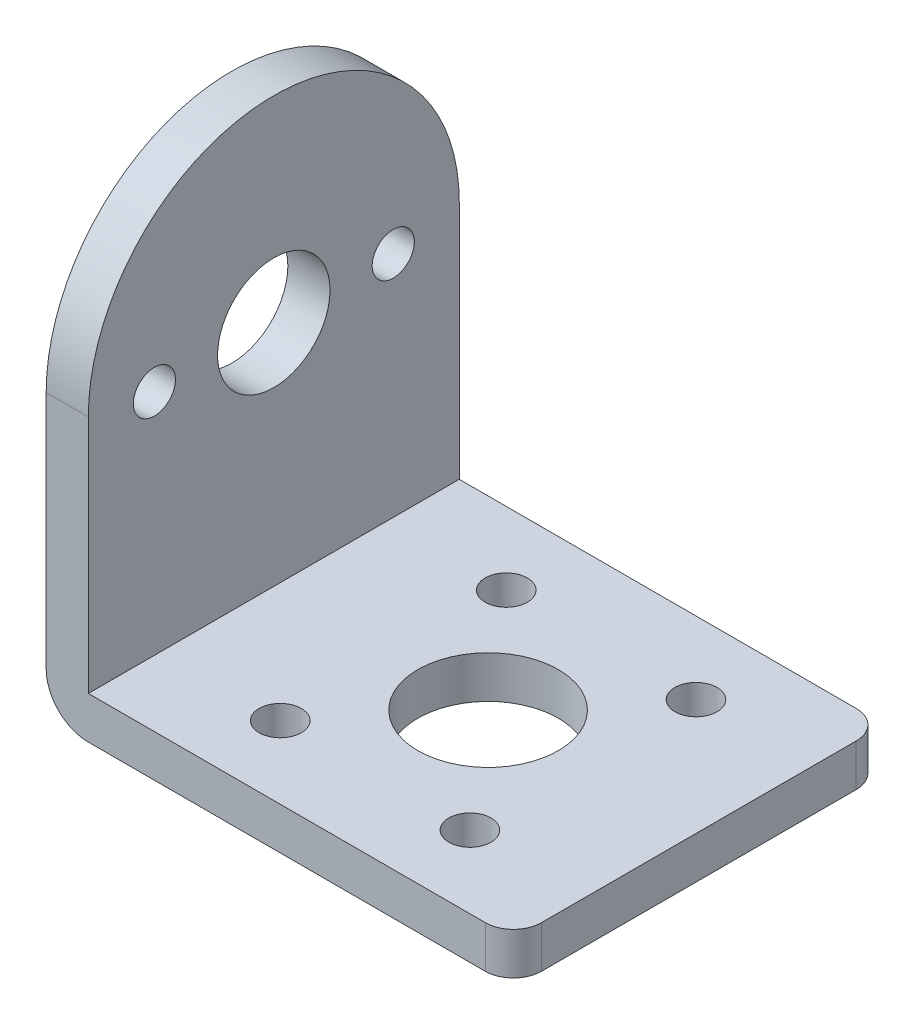
ISO-10303-21;
HEADER;
FILE_DESCRIPTION(('STEP AP214'),'2;1');
FILE_NAME('part.step','',(''),(''),'','','');
FILE_SCHEMA(('AUTOMOTIVE_DESIGN { 1 0 10303 214 1 1 1 1 }'));
ENDSEC;
DATA;
#1=APPLICATION_CONTEXT('core data for automotive mechanical design processes');
#2=APPLICATION_PROTOCOL_DEFINITION('international standard','automotive_design',2000,#1);
#3=PRODUCT_CONTEXT('',#1,'mechanical');
#4=PRODUCT('Part','Part','',(#3));
#5=PRODUCT_RELATED_PRODUCT_CATEGORY('part','',(#4));
#6=PRODUCT_DEFINITION_FORMATION('','',#4);
#7=PRODUCT_DEFINITION_CONTEXT('part definition',#1,'design');
#8=PRODUCT_DEFINITION('design','',#6,#7);
#9=PRODUCT_DEFINITION_SHAPE('','',#8);
#10=(LENGTH_UNIT() NAMED_UNIT(*) SI_UNIT(.MILLI.,.METRE.));
#11=(NAMED_UNIT(*) PLANE_ANGLE_UNIT() SI_UNIT($,.RADIAN.));
#12=(NAMED_UNIT(*) SI_UNIT($,.STERADIAN.) SOLID_ANGLE_UNIT());
#13=UNCERTAINTY_MEASURE_WITH_UNIT(LENGTH_MEASURE(1.E-05),#10,'distance_accuracy_value','');
#14=(GEOMETRIC_REPRESENTATION_CONTEXT(3) GLOBAL_UNCERTAINTY_ASSIGNED_CONTEXT((#13)) GLOBAL_UNIT_ASSIGNED_CONTEXT((#10,
#11,#12)) REPRESENTATION_CONTEXT('',''));
#15=CARTESIAN_POINT('',(0.,0.,0.));
#16=DIRECTION('',(0.,0.,1.));
#17=DIRECTION('',(1.,0.,0.));
#18=AXIS2_PLACEMENT_3D('',#15,#16,#17);
#19=CARTESIAN_POINT('',(-13.625,33.25,0.));
#20=DIRECTION('',(1.,0.,0.));
#21=DIRECTION('',(0.,0.,-1.));
#22=AXIS2_PLACEMENT_3D('',#19,#20,#21);
#23=PLANE('',#22);
#24=CARTESIAN_POINT('',(-13.625,19.25,8.5));
#25=DIRECTION('',(1.,0.,0.));
#26=DIRECTION('',(0.,0.,1.));
#27=AXIS2_PLACEMENT_3D('',#24,#25,#26);
#28=CIRCLE('',#27,1.5);
#29=CARTESIAN_POINT('',(-13.625,19.25,7.));
#30=VERTEX_POINT('',#29);
#31=EDGE_CURVE('E342',#30,#30,#28,.T.);
#32=ORIENTED_EDGE('',*,*,#31,.F.);
#33=EDGE_LOOP('',(#32));
#34=FACE_BOUND('',#33,.T.);
#35=CARTESIAN_POINT('',(-13.625,19.25,-8.5));
#36=DIRECTION('',(1.,0.,0.));
#37=DIRECTION('',(0.,0.,-1.));
#38=AXIS2_PLACEMENT_3D('',#35,#36,#37);
#39=CIRCLE('',#38,1.5);
#40=CARTESIAN_POINT('',(-13.625,19.25,-10.));
#41=VERTEX_POINT('',#40);
#42=EDGE_CURVE('E337',#41,#41,#39,.T.);
#43=ORIENTED_EDGE('',*,*,#42,.F.);
#44=EDGE_LOOP('',(#43));
#45=FACE_BOUND('',#44,.T.);
#46=CARTESIAN_POINT('',(-13.625,19.25,0.));
#47=DIRECTION('',(1.,0.,0.));
#48=DIRECTION('',(0.,0.,-1.));
#49=AXIS2_PLACEMENT_3D('',#46,#47,#48);
#50=CIRCLE('',#49,4.);
#51=CARTESIAN_POINT('',(-13.625,19.25,-4.));
#52=VERTEX_POINT('',#51);
#53=EDGE_CURVE('E331',#52,#52,#50,.T.);
#54=ORIENTED_EDGE('',*,*,#53,.F.);
#55=EDGE_LOOP('',(#54));
#56=FACE_BOUND('',#55,.T.);
#57=DIRECTION('',(0.,-1.,0.));
#58=VECTOR('',#57,1.);
#59=CARTESIAN_POINT('',(-13.625,33.25,-13.2));
#60=LINE('',#59,#58);
#61=CARTESIAN_POINT('',(-13.625,20.05,-13.2));
#62=VERTEX_POINT('',#61);
#63=CARTESIAN_POINT('',(-13.625,3.,-13.2));
#64=VERTEX_POINT('',#63);
#65=EDGE_CURVE('E141',#62,#64,#60,.T.);
#66=ORIENTED_EDGE('',*,*,#65,.F.);
#67=CARTESIAN_POINT('',(-13.625,20.05,0.));
#68=DIRECTION('',(1.,0.,0.));
#69=DIRECTION('',(0.,0.,-1.));
#70=AXIS2_PLACEMENT_3D('',#67,#68,#69);
#71=CIRCLE('',#70,13.2);
#72=CARTESIAN_POINT('',(-13.625,20.05,13.2));
#73=VERTEX_POINT('',#72);
#74=EDGE_CURVE('E130',#62,#73,#71,.T.);
#75=ORIENTED_EDGE('',*,*,#74,.T.);
#76=DIRECTION('',(0.,-1.,0.));
#77=VECTOR('',#76,1.);
#78=CARTESIAN_POINT('',(-13.625,33.25,13.2));
#79=LINE('',#78,#77);
#80=CARTESIAN_POINT('',(-13.625,3.,13.2));
#81=VERTEX_POINT('',#80);
#82=EDGE_CURVE('E143',#73,#81,#79,.T.);
#83=ORIENTED_EDGE('',*,*,#82,.T.);
#84=DIRECTION('',(0.,0.,1.));
#85=VECTOR('',#84,1.);
#86=CARTESIAN_POINT('',(-13.625,3.,0.));
#87=LINE('',#86,#85);
#88=EDGE_CURVE('E156',#64,#81,#87,.T.);
#89=ORIENTED_EDGE('',*,*,#88,.F.);
#90=EDGE_LOOP('',(#66,#75,#83,#89));
#91=FACE_BOUND('',#90,.T.);
#92=ADVANCED_FACE('F43',(#34,#45,#56,#91),#23,.T.);
#93=CARTESIAN_POINT('',(-16.625,33.25,0.));
#94=DIRECTION('',(1.,0.,0.));
#95=DIRECTION('',(0.,0.,-1.));
#96=AXIS2_PLACEMENT_3D('',#93,#94,#95);
#97=PLANE('',#96);
#98=CARTESIAN_POINT('',(-16.625,19.25,8.5));
#99=DIRECTION('',(1.,0.,0.));
#100=DIRECTION('',(0.,0.,1.));
#101=AXIS2_PLACEMENT_3D('',#98,#99,#100);
#102=CIRCLE('',#101,1.5);
#103=CARTESIAN_POINT('',(-16.625,19.25,7.));
#104=VERTEX_POINT('',#103);
#105=EDGE_CURVE('E345',#104,#104,#102,.T.);
#106=ORIENTED_EDGE('',*,*,#105,.T.);
#107=EDGE_LOOP('',(#106));
#108=FACE_BOUND('',#107,.T.);
#109=CARTESIAN_POINT('',(-16.625,19.25,-8.5));
#110=DIRECTION('',(1.,0.,0.));
#111=DIRECTION('',(0.,0.,-1.));
#112=AXIS2_PLACEMENT_3D('',#109,#110,#111);
#113=CIRCLE('',#112,1.5);
#114=CARTESIAN_POINT('',(-16.625,19.25,-10.));
#115=VERTEX_POINT('',#114);
#116=EDGE_CURVE('E333',#115,#115,#113,.T.);
#117=ORIENTED_EDGE('',*,*,#116,.T.);
#118=EDGE_LOOP('',(#117));
#119=FACE_BOUND('',#118,.T.);
#120=CARTESIAN_POINT('',(-16.625,19.25,0.));
#121=DIRECTION('',(1.,0.,0.));
#122=DIRECTION('',(0.,0.,-1.));
#123=AXIS2_PLACEMENT_3D('',#120,#121,#122);
#124=CIRCLE('',#123,4.);
#125=CARTESIAN_POINT('',(-16.625,19.25,-4.));
#126=VERTEX_POINT('',#125);
#127=EDGE_CURVE('E133',#126,#126,#124,.T.);
#128=ORIENTED_EDGE('',*,*,#127,.T.);
#129=EDGE_LOOP('',(#128));
#130=FACE_BOUND('',#129,.T.);
#131=CARTESIAN_POINT('',(-16.625,20.05,0.));
#132=DIRECTION('',(1.,0.,0.));
#133=DIRECTION('',(0.,0.,-1.));
#134=AXIS2_PLACEMENT_3D('',#131,#132,#133);
#135=CIRCLE('',#134,13.2);
#136=CARTESIAN_POINT('',(-16.625,20.05,-13.2));
#137=VERTEX_POINT('',#136);
#138=CARTESIAN_POINT('',(-16.625,20.05,13.2));
#139=VERTEX_POINT('',#138);
#140=EDGE_CURVE('E114',#137,#139,#135,.T.);
#141=ORIENTED_EDGE('',*,*,#140,.F.);
#142=DIRECTION('',(0.,-1.,0.));
#143=VECTOR('',#142,1.);
#144=CARTESIAN_POINT('',(-16.625,33.25,-13.2));
#145=LINE('',#144,#143);
#146=CARTESIAN_POINT('',(-16.625,3.,-13.2));
#147=VERTEX_POINT('',#146);
#148=EDGE_CURVE('E119',#137,#147,#145,.T.);
#149=ORIENTED_EDGE('',*,*,#148,.T.);
#150=DIRECTION('',(0.,0.,1.));
#151=VECTOR('',#150,1.);
#152=CARTESIAN_POINT('',(-16.625,3.,0.));
#153=LINE('',#152,#151);
#154=CARTESIAN_POINT('',(-16.625,3.,13.2));
#155=VERTEX_POINT('',#154);
#156=EDGE_CURVE('E161',#147,#155,#153,.T.);
#157=ORIENTED_EDGE('',*,*,#156,.T.);
#158=DIRECTION('',(0.,-1.,0.));
#159=VECTOR('',#158,1.);
#160=CARTESIAN_POINT('',(-16.625,33.25,13.2));
#161=LINE('',#160,#159);
#162=EDGE_CURVE('E121',#139,#155,#161,.T.);
#163=ORIENTED_EDGE('',*,*,#162,.F.);
#164=EDGE_LOOP('',(#141,#149,#157,#163));
#165=FACE_BOUND('',#164,.T.);
#166=ADVANCED_FACE('F116',(#108,#119,#130,#165),#97,.F.);
#167=CARTESIAN_POINT('',(0.,3.,-13.2));
#168=DIRECTION('',(0.,0.,-1.));
#169=DIRECTION('',(-1.,0.,0.));
#170=AXIS2_PLACEMENT_3D('',#167,#168,#169);
#171=PLANE('',#170);
#172=DIRECTION('',(1.,0.,0.));
#173=VECTOR('',#172,1.);
#174=CARTESIAN_POINT('',(0.,3.,-13.2));
#175=LINE('',#174,#173);
#176=CARTESIAN_POINT('',(14.625,3.,-13.2));
#177=VERTEX_POINT('',#176);
#178=EDGE_CURVE('E153',#64,#177,#175,.T.);
#179=ORIENTED_EDGE('',*,*,#178,.T.);
#180=DIRECTION('',(0.,-1.,0.));
#181=VECTOR('',#180,1.);
#182=CARTESIAN_POINT('',(14.625,3.,-13.2));
#183=LINE('',#182,#181);
#184=CARTESIAN_POINT('',(14.625,0.,-13.2));
#185=VERTEX_POINT('',#184);
#186=EDGE_CURVE('E174',#177,#185,#183,.T.);
#187=ORIENTED_EDGE('',*,*,#186,.T.);
#188=DIRECTION('',(1.,0.,0.));
#189=VECTOR('',#188,1.);
#190=CARTESIAN_POINT('',(0.,0.,-13.2));
#191=LINE('',#190,#189);
#192=CARTESIAN_POINT('',(-13.625,0.,-13.2));
#193=VERTEX_POINT('',#192);
#194=EDGE_CURVE('E164',#193,#185,#191,.T.);
#195=ORIENTED_EDGE('',*,*,#194,.F.);
#196=CARTESIAN_POINT('',(-13.625,3.,-13.2));
#197=DIRECTION('',(0.,0.,-1.));
#198=DIRECTION('',(-1.,0.,0.));
#199=AXIS2_PLACEMENT_3D('',#196,#197,#198);
#200=CIRCLE('',#199,3.);
#201=EDGE_CURVE('E139',#193,#147,#200,.T.);
#202=ORIENTED_EDGE('',*,*,#201,.T.);
#203=ORIENTED_EDGE('',*,*,#148,.F.);
#204=DIRECTION('',(1.,0.,0.));
#205=VECTOR('',#204,1.);
#206=CARTESIAN_POINT('',(-16.625,20.05,-13.2));
#207=LINE('',#206,#205);
#208=EDGE_CURVE('E125',#137,#62,#207,.T.);
#209=ORIENTED_EDGE('',*,*,#208,.T.);
#210=ORIENTED_EDGE('',*,*,#65,.T.);
#211=EDGE_LOOP('',(#179,#187,#195,#202,#203,#209,#210));
#212=FACE_BOUND('',#211,.T.);
#213=ADVANCED_FACE('F136',(#212),#171,.T.);
#214=CARTESIAN_POINT('',(0.,3.,13.2));
#215=DIRECTION('',(0.,0.,-1.));
#216=DIRECTION('',(-1.,0.,0.));
#217=AXIS2_PLACEMENT_3D('',#214,#215,#216);
#218=PLANE('',#217);
#219=DIRECTION('',(1.,0.,0.));
#220=VECTOR('',#219,1.);
#221=CARTESIAN_POINT('',(0.,0.,13.2));
#222=LINE('',#221,#220);
#223=CARTESIAN_POINT('',(-13.625,0.,13.2));
#224=VERTEX_POINT('',#223);
#225=CARTESIAN_POINT('',(14.625,0.,13.2));
#226=VERTEX_POINT('',#225);
#227=EDGE_CURVE('E154',#224,#226,#222,.T.);
#228=ORIENTED_EDGE('',*,*,#227,.T.);
#229=DIRECTION('',(0.,-1.,0.));
#230=VECTOR('',#229,1.);
#231=CARTESIAN_POINT('',(14.625,3.,13.2));
#232=LINE('',#231,#230);
#233=CARTESIAN_POINT('',(14.625,3.,13.2));
#234=VERTEX_POINT('',#233);
#235=EDGE_CURVE('E12',#226,#234,#232,.F.);
#236=ORIENTED_EDGE('',*,*,#235,.T.);
#237=DIRECTION('',(1.,0.,0.));
#238=VECTOR('',#237,1.);
#239=CARTESIAN_POINT('',(0.,3.,13.2));
#240=LINE('',#239,#238);
#241=EDGE_CURVE('E159',#81,#234,#240,.T.);
#242=ORIENTED_EDGE('',*,*,#241,.F.);
#243=ORIENTED_EDGE('',*,*,#82,.F.);
#244=DIRECTION('',(1.,0.,0.));
#245=VECTOR('',#244,1.);
#246=CARTESIAN_POINT('',(-16.625,20.05,13.2));
#247=LINE('',#246,#245);
#248=EDGE_CURVE('E124',#139,#73,#247,.T.);
#249=ORIENTED_EDGE('',*,*,#248,.F.);
#250=ORIENTED_EDGE('',*,*,#162,.T.);
#251=CARTESIAN_POINT('',(-13.625,3.,13.2));
#252=DIRECTION('',(0.,0.,-1.));
#253=DIRECTION('',(-1.,0.,0.));
#254=AXIS2_PLACEMENT_3D('',#251,#252,#253);
#255=CIRCLE('',#254,3.);
#256=EDGE_CURVE('E169',#155,#224,#255,.F.);
#257=ORIENTED_EDGE('',*,*,#256,.T.);
#258=EDGE_LOOP('',(#228,#236,#242,#243,#249,#250,#257));
#259=FACE_BOUND('',#258,.T.);
#260=ADVANCED_FACE('F203',(#259),#218,.F.);
#261=CARTESIAN_POINT('',(16.625,3.,0.));
#262=DIRECTION('',(1.,0.,0.));
#263=DIRECTION('',(0.,0.,-1.));
#264=AXIS2_PLACEMENT_3D('',#261,#262,#263);
#265=PLANE('',#264);
#266=DIRECTION('',(0.,0.,1.));
#267=VECTOR('',#266,1.);
#268=CARTESIAN_POINT('',(16.625,0.,0.));
#269=LINE('',#268,#267);
#270=CARTESIAN_POINT('',(16.625,0.,-11.2));
#271=VERTEX_POINT('',#270);
#272=CARTESIAN_POINT('',(16.625,0.,11.2));
#273=VERTEX_POINT('',#272);
#274=EDGE_CURVE('E150',#271,#273,#269,.T.);
#275=ORIENTED_EDGE('',*,*,#274,.F.);
#276=DIRECTION('',(0.,-1.,0.));
#277=VECTOR('',#276,1.);
#278=CARTESIAN_POINT('',(16.625,3.,-11.2));
#279=LINE('',#278,#277);
#280=CARTESIAN_POINT('',(16.625,3.,-11.2));
#281=VERTEX_POINT('',#280);
#282=EDGE_CURVE('E184',#271,#281,#279,.F.);
#283=ORIENTED_EDGE('',*,*,#282,.T.);
#284=DIRECTION('',(0.,0.,1.));
#285=VECTOR('',#284,1.);
#286=CARTESIAN_POINT('',(16.625,3.,0.));
#287=LINE('',#286,#285);
#288=CARTESIAN_POINT('',(16.625,3.,11.2));
#289=VERTEX_POINT('',#288);
#290=EDGE_CURVE('E151',#281,#289,#287,.T.);
#291=ORIENTED_EDGE('',*,*,#290,.T.);
#292=DIRECTION('',(0.,-1.,0.));
#293=VECTOR('',#292,1.);
#294=CARTESIAN_POINT('',(16.625,0.,11.2));
#295=LINE('',#294,#293);
#296=EDGE_CURVE('E181',#289,#273,#295,.T.);
#297=ORIENTED_EDGE('',*,*,#296,.T.);
#298=EDGE_LOOP('',(#275,#283,#291,#297));
#299=FACE_BOUND('',#298,.T.);
#300=ADVANCED_FACE('F198',(#299),#265,.T.);
#301=CARTESIAN_POINT('',(0.,3.,0.));
#302=DIRECTION('',(0.,1.,0.));
#303=DIRECTION('',(0.,0.,1.));
#304=AXIS2_PLACEMENT_3D('',#301,#302,#303);
#305=PLANE('',#304);
#306=CARTESIAN_POINT('',(-5.125,3.,-8.04285397107271));
#307=DIRECTION('',(0.,1.,0.));
#308=DIRECTION('',(0.,0.,1.));
#309=AXIS2_PLACEMENT_3D('',#306,#307,#308);
#310=CIRCLE('',#309,1.5);
#311=CARTESIAN_POINT('',(-5.125,3.,-6.5428539710727));
#312=VERTEX_POINT('',#311);
#313=EDGE_CURVE('E357',#312,#312,#310,.T.);
#314=ORIENTED_EDGE('',*,*,#313,.F.);
#315=EDGE_LOOP('',(#314));
#316=FACE_BOUND('',#315,.T.);
#317=CARTESIAN_POINT('',(-5.125,3.,8.04285397107271));
#318=DIRECTION('',(0.,1.,0.));
#319=DIRECTION('',(0.,0.,1.));
#320=AXIS2_PLACEMENT_3D('',#317,#318,#319);
#321=CIRCLE('',#320,1.5);
#322=CARTESIAN_POINT('',(-5.125,3.,9.54285397107271));
#323=VERTEX_POINT('',#322);
#324=EDGE_CURVE('E363',#323,#323,#321,.T.);
#325=ORIENTED_EDGE('',*,*,#324,.F.);
#326=EDGE_LOOP('',(#325));
#327=FACE_BOUND('',#326,.T.);
#328=CARTESIAN_POINT('',(8.375,3.,8.0428539710727));
#329=DIRECTION('',(0.,1.,0.));
#330=DIRECTION('',(0.,0.,1.));
#331=AXIS2_PLACEMENT_3D('',#328,#329,#330);
#332=CIRCLE('',#331,1.5);
#333=CARTESIAN_POINT('',(8.375,3.,9.54285397107271));
#334=VERTEX_POINT('',#333);
#335=EDGE_CURVE('E369',#334,#334,#332,.T.);
#336=ORIENTED_EDGE('',*,*,#335,.F.);
#337=EDGE_LOOP('',(#336));
#338=FACE_BOUND('',#337,.T.);
#339=CARTESIAN_POINT('',(8.375,3.,-8.04285397107271));
#340=DIRECTION('',(0.,1.,0.));
#341=DIRECTION('',(0.,0.,1.));
#342=AXIS2_PLACEMENT_3D('',#339,#340,#341);
#343=CIRCLE('',#342,1.5);
#344=CARTESIAN_POINT('',(8.375,3.,-6.54285397107271));
#345=VERTEX_POINT('',#344);
#346=EDGE_CURVE('E356',#345,#345,#343,.T.);
#347=ORIENTED_EDGE('',*,*,#346,.F.);
#348=EDGE_LOOP('',(#347));
#349=FACE_BOUND('',#348,.T.);
#350=CARTESIAN_POINT('',(1.625,3.,0.));
#351=DIRECTION('',(0.,1.,0.));
#352=DIRECTION('',(0.,0.,1.));
#353=AXIS2_PLACEMENT_3D('',#350,#351,#352);
#354=CIRCLE('',#353,5.);
#355=CARTESIAN_POINT('',(1.625,3.,5.));
#356=VERTEX_POINT('',#355);
#357=EDGE_CURVE('E353',#356,#356,#354,.T.);
#358=ORIENTED_EDGE('',*,*,#357,.F.);
#359=EDGE_LOOP('',(#358));
#360=FACE_BOUND('',#359,.T.);
#361=ORIENTED_EDGE('',*,*,#290,.F.);
#362=CARTESIAN_POINT('',(14.625,3.,-11.2));
#363=DIRECTION('',(0.,1.,0.));
#364=DIRECTION('',(0.,0.,1.));
#365=AXIS2_PLACEMENT_3D('',#362,#363,#364);
#366=CIRCLE('',#365,2.);
#367=EDGE_CURVE('E51',#281,#177,#366,.T.);
#368=ORIENTED_EDGE('',*,*,#367,.T.);
#369=ORIENTED_EDGE('',*,*,#178,.F.);
#370=ORIENTED_EDGE('',*,*,#88,.T.);
#371=ORIENTED_EDGE('',*,*,#241,.T.);
#372=CARTESIAN_POINT('',(14.625,3.,11.2));
#373=DIRECTION('',(0.,1.,0.));
#374=DIRECTION('',(0.,0.,1.));
#375=AXIS2_PLACEMENT_3D('',#372,#373,#374);
#376=CIRCLE('',#375,2.);
#377=EDGE_CURVE('E63',#234,#289,#376,.T.);
#378=ORIENTED_EDGE('',*,*,#377,.T.);
#379=EDGE_LOOP('',(#361,#368,#369,#370,#371,#378));
#380=FACE_BOUND('',#379,.T.);
#381=ADVANCED_FACE('F188',(#316,#327,#338,#349,#360,#380),#305,.T.);
#382=CARTESIAN_POINT('',(0.,0.,0.));
#383=DIRECTION('',(0.,1.,0.));
#384=DIRECTION('',(0.,0.,1.));
#385=AXIS2_PLACEMENT_3D('',#382,#383,#384);
#386=PLANE('',#385);
#387=CARTESIAN_POINT('',(-5.125,0.,-8.04285397107271));
#388=DIRECTION('',(0.,1.,0.));
#389=DIRECTION('',(0.,0.,1.));
#390=AXIS2_PLACEMENT_3D('',#387,#388,#389);
#391=CIRCLE('',#390,1.5);
#392=CARTESIAN_POINT('',(-5.125,0.,-6.5428539710727));
#393=VERTEX_POINT('',#392);
#394=EDGE_CURVE('E360',#393,#393,#391,.F.);
#395=ORIENTED_EDGE('',*,*,#394,.F.);
#396=EDGE_LOOP('',(#395));
#397=FACE_BOUND('',#396,.T.);
#398=CARTESIAN_POINT('',(-5.125,0.,8.04285397107271));
#399=DIRECTION('',(0.,1.,0.));
#400=DIRECTION('',(0.,0.,1.));
#401=AXIS2_PLACEMENT_3D('',#398,#399,#400);
#402=CIRCLE('',#401,1.5);
#403=CARTESIAN_POINT('',(-5.125,0.,9.54285397107271));
#404=VERTEX_POINT('',#403);
#405=EDGE_CURVE('E359',#404,#404,#402,.F.);
#406=ORIENTED_EDGE('',*,*,#405,.F.);
#407=EDGE_LOOP('',(#406));
#408=FACE_BOUND('',#407,.T.);
#409=CARTESIAN_POINT('',(8.375,0.,8.0428539710727));
#410=DIRECTION('',(0.,1.,0.));
#411=DIRECTION('',(0.,0.,1.));
#412=AXIS2_PLACEMENT_3D('',#409,#410,#411);
#413=CIRCLE('',#412,1.5);
#414=CARTESIAN_POINT('',(8.375,0.,9.54285397107271));
#415=VERTEX_POINT('',#414);
#416=EDGE_CURVE('E366',#415,#415,#413,.F.);
#417=ORIENTED_EDGE('',*,*,#416,.F.);
#418=EDGE_LOOP('',(#417));
#419=FACE_BOUND('',#418,.T.);
#420=CARTESIAN_POINT('',(8.375,0.,-8.04285397107271));
#421=DIRECTION('',(0.,1.,0.));
#422=DIRECTION('',(0.,0.,1.));
#423=AXIS2_PLACEMENT_3D('',#420,#421,#422);
#424=CIRCLE('',#423,1.5);
#425=CARTESIAN_POINT('',(8.375,0.,-6.54285397107271));
#426=VERTEX_POINT('',#425);
#427=EDGE_CURVE('E372',#426,#426,#424,.F.);
#428=ORIENTED_EDGE('',*,*,#427,.F.);
#429=EDGE_LOOP('',(#428));
#430=FACE_BOUND('',#429,.T.);
#431=CARTESIAN_POINT('',(1.625,0.,0.));
#432=DIRECTION('',(0.,1.,0.));
#433=DIRECTION('',(0.,0.,1.));
#434=AXIS2_PLACEMENT_3D('',#431,#432,#433);
#435=CIRCLE('',#434,5.);
#436=CARTESIAN_POINT('',(1.625,0.,5.));
#437=VERTEX_POINT('',#436);
#438=EDGE_CURVE('E346',#437,#437,#435,.F.);
#439=ORIENTED_EDGE('',*,*,#438,.F.);
#440=EDGE_LOOP('',(#439));
#441=FACE_BOUND('',#440,.T.);
#442=ORIENTED_EDGE('',*,*,#194,.T.);
#443=CARTESIAN_POINT('',(14.625,0.,-11.2));
#444=DIRECTION('',(0.,1.,0.));
#445=DIRECTION('',(0.,0.,1.));
#446=AXIS2_PLACEMENT_3D('',#443,#444,#445);
#447=CIRCLE('',#446,2.);
#448=EDGE_CURVE('E179',#185,#271,#447,.F.);
#449=ORIENTED_EDGE('',*,*,#448,.T.);
#450=ORIENTED_EDGE('',*,*,#274,.T.);
#451=CARTESIAN_POINT('',(14.625,0.,11.2));
#452=DIRECTION('',(0.,1.,0.));
#453=DIRECTION('',(0.,0.,1.));
#454=AXIS2_PLACEMENT_3D('',#451,#452,#453);
#455=CIRCLE('',#454,2.);
#456=EDGE_CURVE('E177',#273,#226,#455,.F.);
#457=ORIENTED_EDGE('',*,*,#456,.T.);
#458=ORIENTED_EDGE('',*,*,#227,.F.);
#459=DIRECTION('',(0.,0.,1.));
#460=VECTOR('',#459,1.);
#461=CARTESIAN_POINT('',(-13.625,0.,0.));
#462=LINE('',#461,#460);
#463=EDGE_CURVE('E171',#224,#193,#462,.F.);
#464=ORIENTED_EDGE('',*,*,#463,.T.);
#465=EDGE_LOOP('',(#442,#449,#450,#457,#458,#464));
#466=FACE_BOUND('',#465,.T.);
#467=ADVANCED_FACE('F196',(#397,#408,#419,#430,#441,#466),#386,.F.);
#468=CARTESIAN_POINT('',(-13.625,3.,0.));
#469=DIRECTION('',(0.,0.,1.));
#470=DIRECTION('',(1.,0.,0.));
#471=AXIS2_PLACEMENT_3D('',#468,#469,#470);
#472=CYLINDRICAL_SURFACE('',#471,3.);
#473=ORIENTED_EDGE('',*,*,#201,.F.);
#474=ORIENTED_EDGE('',*,*,#463,.F.);
#475=ORIENTED_EDGE('',*,*,#256,.F.);
#476=ORIENTED_EDGE('',*,*,#156,.F.);
#477=EDGE_LOOP('',(#473,#474,#475,#476));
#478=FACE_BOUND('',#477,.T.);
#479=ADVANCED_FACE('F206',(#478),#472,.T.);
#480=CARTESIAN_POINT('',(-16.625,20.05,0.));
#481=DIRECTION('',(1.,0.,0.));
#482=DIRECTION('',(0.,0.,-1.));
#483=AXIS2_PLACEMENT_3D('',#480,#481,#482);
#484=CYLINDRICAL_SURFACE('',#483,13.2);
#485=ORIENTED_EDGE('',*,*,#74,.F.);
#486=ORIENTED_EDGE('',*,*,#208,.F.);
#487=ORIENTED_EDGE('',*,*,#140,.T.);
#488=ORIENTED_EDGE('',*,*,#248,.T.);
#489=EDGE_LOOP('',(#485,#486,#487,#488));
#490=FACE_BOUND('',#489,.T.);
#491=ADVANCED_FACE('F128',(#490),#484,.T.);
#492=CARTESIAN_POINT('',(14.625,3.,-11.2));
#493=DIRECTION('',(0.,-1.,0.));
#494=DIRECTION('',(0.,0.,-1.));
#495=AXIS2_PLACEMENT_3D('',#492,#493,#494);
#496=CYLINDRICAL_SURFACE('',#495,2.);
#497=ORIENTED_EDGE('',*,*,#367,.F.);
#498=ORIENTED_EDGE('',*,*,#282,.F.);
#499=ORIENTED_EDGE('',*,*,#448,.F.);
#500=ORIENTED_EDGE('',*,*,#186,.F.);
#501=EDGE_LOOP('',(#497,#498,#499,#500));
#502=FACE_BOUND('',#501,.T.);
#503=ADVANCED_FACE('F193',(#502),#496,.T.);
#504=CARTESIAN_POINT('',(14.625,3.,11.2));
#505=DIRECTION('',(0.,1.,0.));
#506=DIRECTION('',(0.,0.,1.));
#507=AXIS2_PLACEMENT_3D('',#504,#505,#506);
#508=CYLINDRICAL_SURFACE('',#507,2.);
#509=ORIENTED_EDGE('',*,*,#377,.F.);
#510=ORIENTED_EDGE('',*,*,#235,.F.);
#511=ORIENTED_EDGE('',*,*,#456,.F.);
#512=ORIENTED_EDGE('',*,*,#296,.F.);
#513=EDGE_LOOP('',(#509,#510,#511,#512));
#514=FACE_BOUND('',#513,.T.);
#515=ADVANCED_FACE('F45',(#514),#508,.T.);
#516=CARTESIAN_POINT('',(-16.625,19.25,0.));
#517=DIRECTION('',(1.,0.,0.));
#518=DIRECTION('',(0.,0.,-1.));
#519=AXIS2_PLACEMENT_3D('',#516,#517,#518);
#520=CYLINDRICAL_SURFACE('',#519,4.);
#521=CARTESIAN_POINT('',(-16.625,19.25,-4.));
#522=CARTESIAN_POINT('',(-16.59375,19.25,-4.));
#523=CARTESIAN_POINT('',(-16.5625,19.25,-4.));
#524=CARTESIAN_POINT('',(-16.5,19.25,-4.));
#525=CARTESIAN_POINT('',(-16.46875,19.25,-4.));
#526=CARTESIAN_POINT('',(-16.40625,19.25,-4.));
#527=CARTESIAN_POINT('',(-16.375,19.25,-4.));
#528=CARTESIAN_POINT('',(-16.3125,19.25,-4.));
#529=CARTESIAN_POINT('',(-16.28125,19.25,-4.));
#530=CARTESIAN_POINT('',(-16.21875,19.25,-4.));
#531=CARTESIAN_POINT('',(-16.1875,19.25,-4.));
#532=CARTESIAN_POINT('',(-16.125,19.25,-4.));
#533=CARTESIAN_POINT('',(-16.09375,19.25,-4.));
#534=CARTESIAN_POINT('',(-16.03125,19.25,-4.));
#535=CARTESIAN_POINT('',(-16.,19.25,-4.));
#536=CARTESIAN_POINT('',(-15.9375,19.25,-4.));
#537=CARTESIAN_POINT('',(-15.90625,19.25,-4.));
#538=CARTESIAN_POINT('',(-15.84375,19.25,-4.));
#539=CARTESIAN_POINT('',(-15.8125,19.25,-4.));
#540=CARTESIAN_POINT('',(-15.75,19.25,-4.));
#541=CARTESIAN_POINT('',(-15.71875,19.25,-4.));
#542=CARTESIAN_POINT('',(-15.65625,19.25,-4.));
#543=CARTESIAN_POINT('',(-15.625,19.25,-4.));
#544=CARTESIAN_POINT('',(-15.5625,19.25,-4.));
#545=CARTESIAN_POINT('',(-15.53125,19.25,-4.));
#546=CARTESIAN_POINT('',(-15.46875,19.25,-4.));
#547=CARTESIAN_POINT('',(-15.4375,19.25,-4.));
#548=CARTESIAN_POINT('',(-15.375,19.25,-4.));
#549=CARTESIAN_POINT('',(-15.34375,19.25,-4.));
#550=CARTESIAN_POINT('',(-15.28125,19.25,-4.));
#551=CARTESIAN_POINT('',(-15.25,19.25,-4.));
#552=CARTESIAN_POINT('',(-15.1875,19.25,-4.));
#553=CARTESIAN_POINT('',(-15.15625,19.25,-4.));
#554=CARTESIAN_POINT('',(-15.09375,19.25,-4.));
#555=CARTESIAN_POINT('',(-15.0625,19.25,-4.));
#556=CARTESIAN_POINT('',(-15.,19.25,-4.));
#557=CARTESIAN_POINT('',(-14.96875,19.25,-4.));
#558=CARTESIAN_POINT('',(-14.90625,19.25,-4.));
#559=CARTESIAN_POINT('',(-14.875,19.25,-4.));
#560=CARTESIAN_POINT('',(-14.8125,19.25,-4.));
#561=CARTESIAN_POINT('',(-14.78125,19.25,-4.));
#562=CARTESIAN_POINT('',(-14.71875,19.25,-4.));
#563=CARTESIAN_POINT('',(-14.6875,19.25,-4.));
#564=CARTESIAN_POINT('',(-14.625,19.25,-4.));
#565=CARTESIAN_POINT('',(-14.59375,19.25,-4.));
#566=CARTESIAN_POINT('',(-14.53125,19.25,-4.));
#567=CARTESIAN_POINT('',(-14.5,19.25,-4.));
#568=CARTESIAN_POINT('',(-14.4375,19.25,-4.));
#569=CARTESIAN_POINT('',(-14.40625,19.25,-4.));
#570=CARTESIAN_POINT('',(-14.34375,19.25,-4.));
#571=CARTESIAN_POINT('',(-14.3125,19.25,-4.));
#572=CARTESIAN_POINT('',(-14.25,19.25,-4.));
#573=CARTESIAN_POINT('',(-14.21875,19.25,-4.));
#574=CARTESIAN_POINT('',(-14.15625,19.25,-4.));
#575=CARTESIAN_POINT('',(-14.125,19.25,-4.));
#576=CARTESIAN_POINT('',(-14.0625,19.25,-4.));
#577=CARTESIAN_POINT('',(-14.03125,19.25,-4.));
#578=CARTESIAN_POINT('',(-13.96875,19.25,-4.));
#579=CARTESIAN_POINT('',(-13.9375,19.25,-4.));
#580=CARTESIAN_POINT('',(-13.875,19.25,-4.));
#581=CARTESIAN_POINT('',(-13.84375,19.25,-4.));
#582=CARTESIAN_POINT('',(-13.78125,19.25,-4.));
#583=CARTESIAN_POINT('',(-13.75,19.25,-4.));
#584=CARTESIAN_POINT('',(-13.6875,19.25,-4.));
#585=CARTESIAN_POINT('',(-13.65625,19.25,-4.));
#586=CARTESIAN_POINT('',(-13.625,19.25,-4.));
#587=B_SPLINE_CURVE_WITH_KNOTS('',3,(#521,#522,#523,#524,#525,#526,#527,#528,#529,#530,#531,
#532,#533,#534,#535,#536,#537,#538,#539,#540,#541,#542,#543,#544,#545,#546,#547,#548,#549,#550,
#551,#552,#553,#554,#555,#556,#557,#558,#559,#560,#561,#562,#563,#564,#565,#566,#567,#568,#569,
#570,#571,#572,#573,#574,#575,#576,#577,#578,#579,#580,#581,#582,#583,#584,#585,#586),
.UNSPECIFIED.,.F.,.F.,(4,2,2,2,2,2,2,2,2,2,2,2,2,2,2,2,2,2,2,2,2,2,2,2,2,2,2,2,2,2,2,2,4),(0.,
0.0937500000000001,0.1875,0.28125,0.375,0.46875,0.5625,0.656250000000001,0.750000000000001,
0.843750000000001,0.937500000000001,1.03125,1.125,1.21875,1.3125,1.40625,1.5,1.59375,1.6875,
1.78125,1.875,1.96875,2.06250000000001,2.15625000000001,2.25000000000001,2.34375000000001,
2.43750000000001,2.53125000000001,2.62500000000001,2.71875000000001,2.81250000000001,
2.90625000000001,3.00000000000001),.UNSPECIFIED.);
#588=EDGE_CURVE('BSEAM318',#126,#52,#587,.T.);
#589=ORIENTED_EDGE('',*,*,#127,.F.);
#590=ORIENTED_EDGE('',*,*,#53,.T.);
#591=ORIENTED_EDGE('',*,*,#588,.T.);
#592=ORIENTED_EDGE('',*,*,#588,.F.);
#593=EDGE_LOOP('',(#589,#591,#590,#592));
#594=FACE_BOUND('',#593,.T.);
#595=ADVANCED_FACE('F318',(#594),#520,.F.);
#596=CARTESIAN_POINT('',(-16.625,19.25,-8.5));
#597=DIRECTION('',(1.,0.,0.));
#598=DIRECTION('',(0.,0.,-1.));
#599=AXIS2_PLACEMENT_3D('',#596,#597,#598);
#600=CYLINDRICAL_SURFACE('',#599,1.5);
#601=CARTESIAN_POINT('',(-16.625,19.25,-10.));
#602=CARTESIAN_POINT('',(-16.59375,19.25,-10.));
#603=CARTESIAN_POINT('',(-16.5625,19.25,-10.));
#604=CARTESIAN_POINT('',(-16.5,19.25,-10.));
#605=CARTESIAN_POINT('',(-16.46875,19.25,-10.));
#606=CARTESIAN_POINT('',(-16.40625,19.25,-10.));
#607=CARTESIAN_POINT('',(-16.375,19.25,-10.));
#608=CARTESIAN_POINT('',(-16.3125,19.25,-10.));
#609=CARTESIAN_POINT('',(-16.28125,19.25,-10.));
#610=CARTESIAN_POINT('',(-16.21875,19.25,-10.));
#611=CARTESIAN_POINT('',(-16.1875,19.25,-10.));
#612=CARTESIAN_POINT('',(-16.125,19.25,-10.));
#613=CARTESIAN_POINT('',(-16.09375,19.25,-10.));
#614=CARTESIAN_POINT('',(-16.03125,19.25,-10.));
#615=CARTESIAN_POINT('',(-16.,19.25,-10.));
#616=CARTESIAN_POINT('',(-15.9375,19.25,-10.));
#617=CARTESIAN_POINT('',(-15.90625,19.25,-10.));
#618=CARTESIAN_POINT('',(-15.84375,19.25,-10.));
#619=CARTESIAN_POINT('',(-15.8125,19.25,-10.));
#620=CARTESIAN_POINT('',(-15.75,19.25,-10.));
#621=CARTESIAN_POINT('',(-15.71875,19.25,-10.));
#622=CARTESIAN_POINT('',(-15.65625,19.25,-10.));
#623=CARTESIAN_POINT('',(-15.625,19.25,-10.));
#624=CARTESIAN_POINT('',(-15.5625,19.25,-10.));
#625=CARTESIAN_POINT('',(-15.53125,19.25,-10.));
#626=CARTESIAN_POINT('',(-15.46875,19.25,-10.));
#627=CARTESIAN_POINT('',(-15.4375,19.25,-10.));
#628=CARTESIAN_POINT('',(-15.375,19.25,-10.));
#629=CARTESIAN_POINT('',(-15.34375,19.25,-10.));
#630=CARTESIAN_POINT('',(-15.28125,19.25,-10.));
#631=CARTESIAN_POINT('',(-15.25,19.25,-10.));
#632=CARTESIAN_POINT('',(-15.1875,19.25,-10.));
#633=CARTESIAN_POINT('',(-15.15625,19.25,-10.));
#634=CARTESIAN_POINT('',(-15.09375,19.25,-10.));
#635=CARTESIAN_POINT('',(-15.0625,19.25,-10.));
#636=CARTESIAN_POINT('',(-15.,19.25,-10.));
#637=CARTESIAN_POINT('',(-14.96875,19.25,-10.));
#638=CARTESIAN_POINT('',(-14.90625,19.25,-10.));
#639=CARTESIAN_POINT('',(-14.875,19.25,-10.));
#640=CARTESIAN_POINT('',(-14.8125,19.25,-10.));
#641=CARTESIAN_POINT('',(-14.78125,19.25,-10.));
#642=CARTESIAN_POINT('',(-14.71875,19.25,-10.));
#643=CARTESIAN_POINT('',(-14.6875,19.25,-10.));
#644=CARTESIAN_POINT('',(-14.625,19.25,-10.));
#645=CARTESIAN_POINT('',(-14.59375,19.25,-10.));
#646=CARTESIAN_POINT('',(-14.53125,19.25,-10.));
#647=CARTESIAN_POINT('',(-14.5,19.25,-10.));
#648=CARTESIAN_POINT('',(-14.4375,19.25,-10.));
#649=CARTESIAN_POINT('',(-14.40625,19.25,-10.));
#650=CARTESIAN_POINT('',(-14.34375,19.25,-10.));
#651=CARTESIAN_POINT('',(-14.3125,19.25,-10.));
#652=CARTESIAN_POINT('',(-14.25,19.25,-10.));
#653=CARTESIAN_POINT('',(-14.21875,19.25,-10.));
#654=CARTESIAN_POINT('',(-14.15625,19.25,-10.));
#655=CARTESIAN_POINT('',(-14.125,19.25,-10.));
#656=CARTESIAN_POINT('',(-14.0625,19.25,-10.));
#657=CARTESIAN_POINT('',(-14.03125,19.25,-10.));
#658=CARTESIAN_POINT('',(-13.96875,19.25,-10.));
#659=CARTESIAN_POINT('',(-13.9375,19.25,-10.));
#660=CARTESIAN_POINT('',(-13.875,19.25,-10.));
#661=CARTESIAN_POINT('',(-13.84375,19.25,-10.));
#662=CARTESIAN_POINT('',(-13.78125,19.25,-10.));
#663=CARTESIAN_POINT('',(-13.75,19.25,-10.));
#664=CARTESIAN_POINT('',(-13.6875,19.25,-10.));
#665=CARTESIAN_POINT('',(-13.65625,19.25,-10.));
#666=CARTESIAN_POINT('',(-13.625,19.25,-10.));
#667=B_SPLINE_CURVE_WITH_KNOTS('',3,(#601,#602,#603,#604,#605,#606,#607,#608,#609,#610,#611,
#612,#613,#614,#615,#616,#617,#618,#619,#620,#621,#622,#623,#624,#625,#626,#627,#628,#629,#630,
#631,#632,#633,#634,#635,#636,#637,#638,#639,#640,#641,#642,#643,#644,#645,#646,#647,#648,#649,
#650,#651,#652,#653,#654,#655,#656,#657,#658,#659,#660,#661,#662,#663,#664,#665,#666),
.UNSPECIFIED.,.F.,.F.,(4,2,2,2,2,2,2,2,2,2,2,2,2,2,2,2,2,2,2,2,2,2,2,2,2,2,2,2,2,2,2,2,4),(0.,
0.0937500000000036,0.187500000000004,0.281250000000004,0.375000000000004,0.468750000000004,
0.562500000000004,0.656250000000004,0.750000000000004,0.843750000000004,0.937500000000004,
1.03125,1.125,1.21875,1.3125,1.40625,1.5,1.59375,1.6875,1.78125000000001,1.87500000000001,
1.96875000000001,2.06250000000001,2.15625000000001,2.25000000000001,2.34375000000001,
2.43750000000001,2.53125000000001,2.62500000000001,2.71875000000001,2.81250000000001,
2.90625000000001,3.00000000000001),.UNSPECIFIED.);
#668=EDGE_CURVE('BSEAM315',#115,#41,#667,.T.);
#669=ORIENTED_EDGE('',*,*,#116,.F.);
#670=ORIENTED_EDGE('',*,*,#42,.T.);
#671=ORIENTED_EDGE('',*,*,#668,.T.);
#672=ORIENTED_EDGE('',*,*,#668,.F.);
#673=EDGE_LOOP('',(#669,#671,#670,#672));
#674=FACE_BOUND('',#673,.T.);
#675=ADVANCED_FACE('F315',(#674),#600,.F.);
#676=CARTESIAN_POINT('',(-16.625,19.25,8.5));
#677=DIRECTION('',(1.,0.,0.));
#678=DIRECTION('',(0.,0.,-1.));
#679=AXIS2_PLACEMENT_3D('',#676,#677,#678);
#680=CYLINDRICAL_SURFACE('',#679,1.5);
#681=CARTESIAN_POINT('',(-16.625,19.25,7.));
#682=CARTESIAN_POINT('',(-16.59375,19.25,7.));
#683=CARTESIAN_POINT('',(-16.5625,19.25,7.));
#684=CARTESIAN_POINT('',(-16.5,19.25,7.));
#685=CARTESIAN_POINT('',(-16.46875,19.25,7.));
#686=CARTESIAN_POINT('',(-16.40625,19.25,7.));
#687=CARTESIAN_POINT('',(-16.375,19.25,7.));
#688=CARTESIAN_POINT('',(-16.3125,19.25,7.));
#689=CARTESIAN_POINT('',(-16.28125,19.25,7.));
#690=CARTESIAN_POINT('',(-16.21875,19.25,7.));
#691=CARTESIAN_POINT('',(-16.1875,19.25,7.));
#692=CARTESIAN_POINT('',(-16.125,19.25,7.));
#693=CARTESIAN_POINT('',(-16.09375,19.25,7.));
#694=CARTESIAN_POINT('',(-16.03125,19.25,7.));
#695=CARTESIAN_POINT('',(-16.,19.25,7.));
#696=CARTESIAN_POINT('',(-15.9375,19.25,7.));
#697=CARTESIAN_POINT('',(-15.90625,19.25,7.));
#698=CARTESIAN_POINT('',(-15.84375,19.25,7.));
#699=CARTESIAN_POINT('',(-15.8125,19.25,7.));
#700=CARTESIAN_POINT('',(-15.75,19.25,7.));
#701=CARTESIAN_POINT('',(-15.71875,19.25,7.));
#702=CARTESIAN_POINT('',(-15.65625,19.25,7.));
#703=CARTESIAN_POINT('',(-15.625,19.25,7.));
#704=CARTESIAN_POINT('',(-15.5625,19.25,7.));
#705=CARTESIAN_POINT('',(-15.53125,19.25,7.));
#706=CARTESIAN_POINT('',(-15.46875,19.25,7.));
#707=CARTESIAN_POINT('',(-15.4375,19.25,7.));
#708=CARTESIAN_POINT('',(-15.375,19.25,7.));
#709=CARTESIAN_POINT('',(-15.34375,19.25,7.));
#710=CARTESIAN_POINT('',(-15.28125,19.25,7.));
#711=CARTESIAN_POINT('',(-15.25,19.25,7.));
#712=CARTESIAN_POINT('',(-15.1875,19.25,7.));
#713=CARTESIAN_POINT('',(-15.15625,19.25,7.));
#714=CARTESIAN_POINT('',(-15.09375,19.25,7.));
#715=CARTESIAN_POINT('',(-15.0625,19.25,7.));
#716=CARTESIAN_POINT('',(-15.,19.25,7.));
#717=CARTESIAN_POINT('',(-14.96875,19.25,7.));
#718=CARTESIAN_POINT('',(-14.90625,19.25,7.));
#719=CARTESIAN_POINT('',(-14.875,19.25,7.));
#720=CARTESIAN_POINT('',(-14.8125,19.25,7.));
#721=CARTESIAN_POINT('',(-14.78125,19.25,7.));
#722=CARTESIAN_POINT('',(-14.71875,19.25,7.));
#723=CARTESIAN_POINT('',(-14.6875,19.25,7.));
#724=CARTESIAN_POINT('',(-14.625,19.25,7.));
#725=CARTESIAN_POINT('',(-14.59375,19.25,7.));
#726=CARTESIAN_POINT('',(-14.53125,19.25,7.));
#727=CARTESIAN_POINT('',(-14.5,19.25,7.));
#728=CARTESIAN_POINT('',(-14.4375,19.25,7.));
#729=CARTESIAN_POINT('',(-14.40625,19.25,7.));
#730=CARTESIAN_POINT('',(-14.34375,19.25,7.));
#731=CARTESIAN_POINT('',(-14.3125,19.25,7.));
#732=CARTESIAN_POINT('',(-14.25,19.25,7.));
#733=CARTESIAN_POINT('',(-14.21875,19.25,7.));
#734=CARTESIAN_POINT('',(-14.15625,19.25,7.));
#735=CARTESIAN_POINT('',(-14.125,19.25,7.));
#736=CARTESIAN_POINT('',(-14.0625,19.25,7.));
#737=CARTESIAN_POINT('',(-14.03125,19.25,7.));
#738=CARTESIAN_POINT('',(-13.96875,19.25,7.));
#739=CARTESIAN_POINT('',(-13.9375,19.25,7.));
#740=CARTESIAN_POINT('',(-13.875,19.25,7.));
#741=CARTESIAN_POINT('',(-13.84375,19.25,7.));
#742=CARTESIAN_POINT('',(-13.78125,19.25,7.));
#743=CARTESIAN_POINT('',(-13.75,19.25,7.));
#744=CARTESIAN_POINT('',(-13.6875,19.25,7.));
#745=CARTESIAN_POINT('',(-13.65625,19.25,7.));
#746=CARTESIAN_POINT('',(-13.625,19.25,7.));
#747=B_SPLINE_CURVE_WITH_KNOTS('',3,(#681,#682,#683,#684,#685,#686,#687,#688,#689,#690,#691,
#692,#693,#694,#695,#696,#697,#698,#699,#700,#701,#702,#703,#704,#705,#706,#707,#708,#709,#710,
#711,#712,#713,#714,#715,#716,#717,#718,#719,#720,#721,#722,#723,#724,#725,#726,#727,#728,#729,
#730,#731,#732,#733,#734,#735,#736,#737,#738,#739,#740,#741,#742,#743,#744,#745,#746),
.UNSPECIFIED.,.F.,.F.,(4,2,2,2,2,2,2,2,2,2,2,2,2,2,2,2,2,2,2,2,2,2,2,2,2,2,2,2,2,2,2,2,4),(0.,
0.0937500000000036,0.187500000000004,0.281250000000004,0.375000000000004,0.468750000000004,
0.562500000000004,0.656250000000004,0.750000000000004,0.843750000000004,0.937500000000004,
1.03125,1.125,1.21875,1.3125,1.40625,1.5,1.59375,1.6875,1.78125000000001,1.87500000000001,
1.96875000000001,2.06250000000001,2.15625000000001,2.25000000000001,2.34375000000001,
2.43750000000001,2.53125000000001,2.62500000000001,2.71875000000001,2.81250000000001,
2.90625000000001,3.00000000000001),.UNSPECIFIED.);
#748=EDGE_CURVE('BSEAM263',#104,#30,#747,.T.);
#749=ORIENTED_EDGE('',*,*,#105,.F.);
#750=ORIENTED_EDGE('',*,*,#31,.T.);
#751=ORIENTED_EDGE('',*,*,#748,.T.);
#752=ORIENTED_EDGE('',*,*,#748,.F.);
#753=EDGE_LOOP('',(#749,#751,#750,#752));
#754=FACE_BOUND('',#753,.T.);
#755=ADVANCED_FACE('F263',(#754),#680,.F.);
#756=CARTESIAN_POINT('',(1.625,-0.001000000000001,0.));
#757=DIRECTION('',(0.,1.,0.));
#758=DIRECTION('',(0.,0.,1.));
#759=AXIS2_PLACEMENT_3D('',#756,#757,#758);
#760=CYLINDRICAL_SURFACE('',#759,5.);
#761=ORIENTED_EDGE('',*,*,#357,.T.);
#762=EDGE_LOOP('',(#761));
#763=FACE_BOUND('',#762,.T.);
#764=ORIENTED_EDGE('',*,*,#438,.T.);
#765=EDGE_LOOP('',(#764));
#766=FACE_BOUND('',#765,.T.);
#767=ADVANCED_FACE('F257',(#763,#766),#760,.F.);
#768=CARTESIAN_POINT('',(8.375,-0.001000000000001,-8.04285397107271));
#769=DIRECTION('',(0.,1.,0.));
#770=DIRECTION('',(0.,0.,1.));
#771=AXIS2_PLACEMENT_3D('',#768,#769,#770);
#772=CYLINDRICAL_SURFACE('',#771,1.5);
#773=ORIENTED_EDGE('',*,*,#346,.T.);
#774=EDGE_LOOP('',(#773));
#775=FACE_BOUND('',#774,.T.);
#776=ORIENTED_EDGE('',*,*,#427,.T.);
#777=EDGE_LOOP('',(#776));
#778=FACE_BOUND('',#777,.T.);
#779=ADVANCED_FACE('F262',(#775,#778),#772,.F.);
#780=CARTESIAN_POINT('',(8.375,-0.001000000000001,8.0428539710727));
#781=DIRECTION('',(0.,1.,0.));
#782=DIRECTION('',(0.,0.,1.));
#783=AXIS2_PLACEMENT_3D('',#780,#781,#782);
#784=CYLINDRICAL_SURFACE('',#783,1.5);
#785=ORIENTED_EDGE('',*,*,#335,.T.);
#786=EDGE_LOOP('',(#785));
#787=FACE_BOUND('',#786,.T.);
#788=ORIENTED_EDGE('',*,*,#416,.T.);
#789=EDGE_LOOP('',(#788));
#790=FACE_BOUND('',#789,.T.);
#791=ADVANCED_FACE('F275',(#787,#790),#784,.F.);
#792=CARTESIAN_POINT('',(-5.125,-0.001000000000001,8.04285397107271));
#793=DIRECTION('',(0.,1.,0.));
#794=DIRECTION('',(0.,0.,1.));
#795=AXIS2_PLACEMENT_3D('',#792,#793,#794);
#796=CYLINDRICAL_SURFACE('',#795,1.5);
#797=ORIENTED_EDGE('',*,*,#324,.T.);
#798=EDGE_LOOP('',(#797));
#799=FACE_BOUND('',#798,.T.);
#800=ORIENTED_EDGE('',*,*,#405,.T.);
#801=EDGE_LOOP('',(#800));
#802=FACE_BOUND('',#801,.T.);
#803=ADVANCED_FACE('F285',(#799,#802),#796,.F.);
#804=CARTESIAN_POINT('',(-5.125,-0.001000000000001,-8.04285397107271));
#805=DIRECTION('',(0.,1.,0.));
#806=DIRECTION('',(0.,0.,1.));
#807=AXIS2_PLACEMENT_3D('',#804,#805,#806);
#808=CYLINDRICAL_SURFACE('',#807,1.5);
#809=ORIENTED_EDGE('',*,*,#313,.T.);
#810=EDGE_LOOP('',(#809));
#811=FACE_BOUND('',#810,.T.);
#812=ORIENTED_EDGE('',*,*,#394,.T.);
#813=EDGE_LOOP('',(#812));
#814=FACE_BOUND('',#813,.T.);
#815=ADVANCED_FACE('F295',(#811,#814),#808,.F.);
#816=CLOSED_SHELL('',(#92,#166,#213,#260,#300,#381,#467,#479,#491,#503,#515,#595,#675,#755,#767,
#779,#791,#803,#815));
#817=MANIFOLD_SOLID_BREP('B2',#816);
#818=ADVANCED_BREP_SHAPE_REPRESENTATION('',(#18,#817),#14);
#819=SHAPE_DEFINITION_REPRESENTATION(#9,#818);
ENDSEC;
END-ISO-10303-21;
